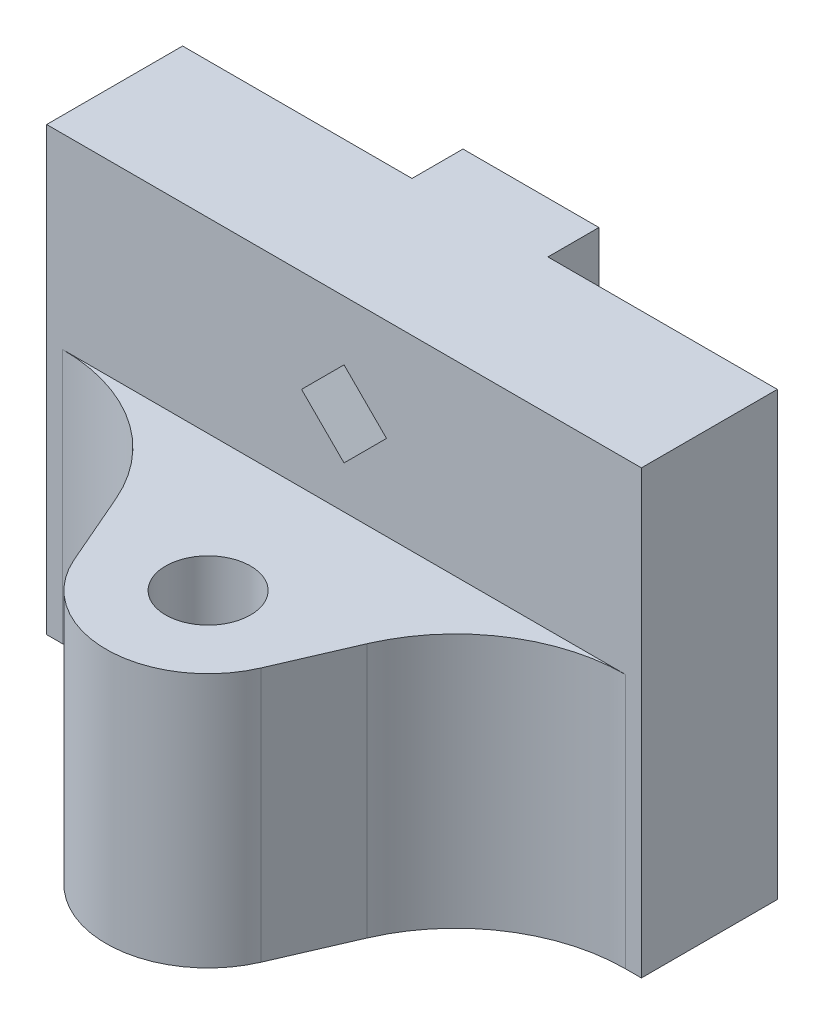
ISO-10303-21;
HEADER;
FILE_DESCRIPTION(('STEP AP214'),'2;1');
FILE_NAME('part.step','',(''),(''),'','','');
FILE_SCHEMA(('AUTOMOTIVE_DESIGN { 1 0 10303 214 1 1 1 1 }'));
ENDSEC;
DATA;
#1=APPLICATION_CONTEXT('core data for automotive mechanical design processes');
#2=APPLICATION_PROTOCOL_DEFINITION('international standard','automotive_design',2000,#1);
#3=PRODUCT_CONTEXT('',#1,'mechanical');
#4=PRODUCT('Part','Part','',(#3));
#5=PRODUCT_RELATED_PRODUCT_CATEGORY('part','',(#4));
#6=PRODUCT_DEFINITION_FORMATION('','',#4);
#7=PRODUCT_DEFINITION_CONTEXT('part definition',#1,'design');
#8=PRODUCT_DEFINITION('design','',#6,#7);
#9=PRODUCT_DEFINITION_SHAPE('','',#8);
#10=(LENGTH_UNIT() NAMED_UNIT(*) SI_UNIT(.MILLI.,.METRE.));
#11=(NAMED_UNIT(*) PLANE_ANGLE_UNIT() SI_UNIT($,.RADIAN.));
#12=(NAMED_UNIT(*) SI_UNIT($,.STERADIAN.) SOLID_ANGLE_UNIT());
#13=UNCERTAINTY_MEASURE_WITH_UNIT(LENGTH_MEASURE(1.E-05),#10,'distance_accuracy_value','');
#14=(GEOMETRIC_REPRESENTATION_CONTEXT(3) GLOBAL_UNCERTAINTY_ASSIGNED_CONTEXT((#13)) GLOBAL_UNIT_ASSIGNED_CONTEXT((#10,
#11,#12)) REPRESENTATION_CONTEXT('',''));
#15=CARTESIAN_POINT('',(0.,0.,0.));
#16=DIRECTION('',(0.,0.,1.));
#17=DIRECTION('',(1.,0.,0.));
#18=AXIS2_PLACEMENT_3D('',#15,#16,#17);
#19=CARTESIAN_POINT('',(0.,0.,0.));
#20=DIRECTION('',(0.,0.,1.));
#21=DIRECTION('',(1.,0.,0.));
#22=AXIS2_PLACEMENT_3D('',#19,#20,#21);
#23=PLANE('',#22);
#24=DIRECTION('',(0.,1.,0.));
#25=VECTOR('',#24,1.);
#26=CARTESIAN_POINT('',(-4.00000000000001,6.,0.));
#27=LINE('',#26,#25);
#28=CARTESIAN_POINT('',(-4.00000000000001,-20.,0.));
#29=VERTEX_POINT('',#28);
#30=CARTESIAN_POINT('',(-4.00000000000001,6.,0.));
#31=VERTEX_POINT('',#30);
#32=EDGE_CURVE('E205',#29,#31,#27,.T.);
#33=ORIENTED_EDGE('',*,*,#32,.F.);
#34=DIRECTION('',(1.,0.,0.));
#35=VECTOR('',#34,1.);
#36=CARTESIAN_POINT('',(-17.5,-20.,0.));
#37=LINE('',#36,#35);
#38=CARTESIAN_POINT('',(-17.5,-20.,0.));
#39=VERTEX_POINT('',#38);
#40=EDGE_CURVE('E371',#39,#29,#37,.T.);
#41=ORIENTED_EDGE('',*,*,#40,.F.);
#42=DIRECTION('',(0.,-1.,0.));
#43=VECTOR('',#42,1.);
#44=CARTESIAN_POINT('',(-17.5,5.99999999999999,0.));
#45=LINE('',#44,#43);
#46=CARTESIAN_POINT('',(-17.5,5.99999999999999,0.));
#47=VERTEX_POINT('',#46);
#48=EDGE_CURVE('E375',#47,#39,#45,.T.);
#49=ORIENTED_EDGE('',*,*,#48,.F.);
#50=DIRECTION('',(-1.,0.,0.));
#51=VECTOR('',#50,1.);
#52=CARTESIAN_POINT('',(17.5,6.,0.));
#53=LINE('',#52,#51);
#54=EDGE_CURVE('E354',#31,#47,#53,.T.);
#55=ORIENTED_EDGE('',*,*,#54,.F.);
#56=EDGE_LOOP('',(#33,#41,#49,#55));
#57=FACE_BOUND('',#56,.T.);
#58=ADVANCED_FACE('F34',(#57),#23,.F.);
#59=DIRECTION('',(0.,-1.,0.));
#60=VECTOR('',#59,1.);
#61=CARTESIAN_POINT('',(4.00000000000001,6.,0.));
#62=LINE('',#61,#60);
#63=CARTESIAN_POINT('',(4.,6.,0.));
#64=VERTEX_POINT('',#63);
#65=CARTESIAN_POINT('',(4.,-20.,0.));
#66=VERTEX_POINT('',#65);
#67=EDGE_CURVE('E201',#64,#66,#62,.T.);
#68=ORIENTED_EDGE('',*,*,#67,.F.);
#69=CARTESIAN_POINT('',(17.5,6.,0.));
#70=VERTEX_POINT('',#69);
#71=EDGE_CURVE('E347',#70,#64,#53,.T.);
#72=ORIENTED_EDGE('',*,*,#71,.F.);
#73=DIRECTION('',(0.,1.,0.));
#74=VECTOR('',#73,1.);
#75=CARTESIAN_POINT('',(17.5,6.,0.));
#76=LINE('',#75,#74);
#77=CARTESIAN_POINT('',(17.5,-20.,0.));
#78=VERTEX_POINT('',#77);
#79=EDGE_CURVE('E373',#78,#70,#76,.T.);
#80=ORIENTED_EDGE('',*,*,#79,.F.);
#81=EDGE_CURVE('E220',#66,#78,#37,.T.);
#82=ORIENTED_EDGE('',*,*,#81,.F.);
#83=EDGE_LOOP('',(#68,#72,#80,#82));
#84=FACE_BOUND('',#83,.T.);
#85=ADVANCED_FACE('F325',(#84),#23,.F.);
#86=CARTESIAN_POINT('',(0.,0.,8.));
#87=DIRECTION('',(0.,0.,1.));
#88=DIRECTION('',(1.,0.,0.));
#89=AXIS2_PLACEMENT_3D('',#86,#87,#88);
#90=PLANE('',#89);
#91=DIRECTION('',(1.,0.,0.));
#92=VECTOR('',#91,1.);
#93=CARTESIAN_POINT('',(0.,-5.,8.));
#94=LINE('',#93,#92);
#95=CARTESIAN_POINT('',(-16.5685424949238,-5.,8.));
#96=VERTEX_POINT('',#95);
#97=CARTESIAN_POINT('',(16.5685424949238,-5.,8.));
#98=VERTEX_POINT('',#97);
#99=EDGE_CURVE('E170',#96,#98,#94,.T.);
#100=ORIENTED_EDGE('',*,*,#99,.T.);
#101=DIRECTION('',(0.,-1.,0.));
#102=VECTOR('',#101,1.);
#103=CARTESIAN_POINT('',(16.5685424949238,-20.,8.));
#104=LINE('',#103,#102);
#105=CARTESIAN_POINT('',(16.5685424949238,-20.,8.));
#106=VERTEX_POINT('',#105);
#107=EDGE_CURVE('E267',#98,#106,#104,.T.);
#108=ORIENTED_EDGE('',*,*,#107,.T.);
#109=DIRECTION('',(1.,0.,0.));
#110=VECTOR('',#109,1.);
#111=CARTESIAN_POINT('',(-17.5,-20.,8.));
#112=LINE('',#111,#110);
#113=CARTESIAN_POINT('',(17.5,-20.,8.));
#114=VERTEX_POINT('',#113);
#115=EDGE_CURVE('E250',#106,#114,#112,.T.);
#116=ORIENTED_EDGE('',*,*,#115,.T.);
#117=DIRECTION('',(0.,1.,0.));
#118=VECTOR('',#117,1.);
#119=CARTESIAN_POINT('',(17.5,6.,8.));
#120=LINE('',#119,#118);
#121=CARTESIAN_POINT('',(17.5,6.,8.));
#122=VERTEX_POINT('',#121);
#123=EDGE_CURVE('E249',#114,#122,#120,.T.);
#124=ORIENTED_EDGE('',*,*,#123,.T.);
#125=DIRECTION('',(-1.,0.,0.));
#126=VECTOR('',#125,1.);
#127=CARTESIAN_POINT('',(17.5,6.,8.));
#128=LINE('',#127,#126);
#129=CARTESIAN_POINT('',(-17.5,5.99999999999999,8.));
#130=VERTEX_POINT('',#129);
#131=EDGE_CURVE('E390',#122,#130,#128,.T.);
#132=ORIENTED_EDGE('',*,*,#131,.T.);
#133=DIRECTION('',(0.,-1.,0.));
#134=VECTOR('',#133,1.);
#135=CARTESIAN_POINT('',(-17.5,5.99999999999999,8.));
#136=LINE('',#135,#134);
#137=CARTESIAN_POINT('',(-17.5,-20.,8.));
#138=VERTEX_POINT('',#137);
#139=EDGE_CURVE('E256',#130,#138,#136,.T.);
#140=ORIENTED_EDGE('',*,*,#139,.T.);
#141=CARTESIAN_POINT('',(-16.5685424949238,-20.,8.));
#142=VERTEX_POINT('',#141);
#143=EDGE_CURVE('E245',#138,#142,#112,.T.);
#144=ORIENTED_EDGE('',*,*,#143,.T.);
#145=DIRECTION('',(0.,-1.,0.));
#146=VECTOR('',#145,1.);
#147=CARTESIAN_POINT('',(-16.5685424949238,-5.,8.));
#148=LINE('',#147,#146);
#149=EDGE_CURVE('E264',#142,#96,#148,.F.);
#150=ORIENTED_EDGE('',*,*,#149,.T.);
#151=EDGE_LOOP('',(#100,#108,#116,#124,#132,#140,#144,#150));
#152=FACE_BOUND('',#151,.T.);
#153=DIRECTION('',(-0.707106781186548,-0.707106781186548,0.));
#154=VECTOR('',#153,1.);
#155=CARTESIAN_POINT('',(0.,2.5,8.));
#156=LINE('',#155,#154);
#157=CARTESIAN_POINT('',(0.,2.5,8.));
#158=VERTEX_POINT('',#157);
#159=CARTESIAN_POINT('',(-2.5,0.,8.));
#160=VERTEX_POINT('',#159);
#161=EDGE_CURVE('E407',#158,#160,#156,.T.);
#162=ORIENTED_EDGE('',*,*,#161,.F.);
#163=DIRECTION('',(-0.707106781186549,0.707106781186546,0.));
#164=VECTOR('',#163,1.);
#165=CARTESIAN_POINT('',(2.50000000000001,0.,8.));
#166=LINE('',#165,#164);
#167=CARTESIAN_POINT('',(2.50000000000001,0.,8.));
#168=VERTEX_POINT('',#167);
#169=EDGE_CURVE('E232',#168,#158,#166,.T.);
#170=ORIENTED_EDGE('',*,*,#169,.F.);
#171=DIRECTION('',(0.707106781186549,0.707106781186546,0.));
#172=VECTOR('',#171,1.);
#173=CARTESIAN_POINT('',(0.,-2.5,8.));
#174=LINE('',#173,#172);
#175=CARTESIAN_POINT('',(0.,-2.5,8.));
#176=VERTEX_POINT('',#175);
#177=EDGE_CURVE('E402',#176,#168,#174,.T.);
#178=ORIENTED_EDGE('',*,*,#177,.F.);
#179=DIRECTION('',(0.707106781186548,-0.707106781186548,0.));
#180=VECTOR('',#179,1.);
#181=CARTESIAN_POINT('',(-2.5,0.,8.));
#182=LINE('',#181,#180);
#183=EDGE_CURVE('E404',#160,#176,#182,.T.);
#184=ORIENTED_EDGE('',*,*,#183,.F.);
#185=EDGE_LOOP('',(#162,#170,#178,#184));
#186=FACE_BOUND('',#185,.T.);
#187=ADVANCED_FACE('F288',(#152,#186),#90,.T.);
#188=CARTESIAN_POINT('',(-17.5,5.99999999999999,8.));
#189=DIRECTION('',(1.,0.,0.));
#190=DIRECTION('',(0.,1.,0.));
#191=AXIS2_PLACEMENT_3D('',#188,#189,#190);
#192=PLANE('',#191);
#193=ORIENTED_EDGE('',*,*,#48,.T.);
#194=DIRECTION('',(0.,0.,-1.));
#195=VECTOR('',#194,1.);
#196=CARTESIAN_POINT('',(-17.5,-20.,8.));
#197=LINE('',#196,#195);
#198=EDGE_CURVE('E268',#138,#39,#197,.T.);
#199=ORIENTED_EDGE('',*,*,#198,.F.);
#200=ORIENTED_EDGE('',*,*,#139,.F.);
#201=DIRECTION('',(0.,0.,-1.));
#202=VECTOR('',#201,1.);
#203=CARTESIAN_POINT('',(-17.5,5.99999999999999,8.));
#204=LINE('',#203,#202);
#205=EDGE_CURVE('E383',#130,#47,#204,.T.);
#206=ORIENTED_EDGE('',*,*,#205,.T.);
#207=EDGE_LOOP('',(#193,#199,#200,#206));
#208=FACE_BOUND('',#207,.T.);
#209=ADVANCED_FACE('F313',(#208),#192,.F.);
#210=CARTESIAN_POINT('',(-17.5,-20.,8.));
#211=DIRECTION('',(0.,1.,0.));
#212=DIRECTION('',(-1.,0.,0.));
#213=AXIS2_PLACEMENT_3D('',#210,#211,#212);
#214=PLANE('',#213);
#215=ORIENTED_EDGE('',*,*,#40,.T.);
#216=DIRECTION('',(0.,0.,1.));
#217=VECTOR('',#216,1.);
#218=CARTESIAN_POINT('',(-4.00000000000001,-20.,-3.));
#219=LINE('',#218,#217);
#220=CARTESIAN_POINT('',(-4.00000000000001,-20.,-3.));
#221=VERTEX_POINT('',#220);
#222=EDGE_CURVE('E227',#221,#29,#219,.T.);
#223=ORIENTED_EDGE('',*,*,#222,.F.);
#224=DIRECTION('',(-1.,0.,0.));
#225=VECTOR('',#224,1.);
#226=CARTESIAN_POINT('',(4.,-20.,-3.));
#227=LINE('',#226,#225);
#228=CARTESIAN_POINT('',(4.,-20.,-3.));
#229=VERTEX_POINT('',#228);
#230=EDGE_CURVE('E207',#229,#221,#227,.T.);
#231=ORIENTED_EDGE('',*,*,#230,.F.);
#232=DIRECTION('',(0.,0.,1.));
#233=VECTOR('',#232,1.);
#234=CARTESIAN_POINT('',(4.,-20.,-3.));
#235=LINE('',#234,#233);
#236=EDGE_CURVE('E223',#229,#66,#235,.T.);
#237=ORIENTED_EDGE('',*,*,#236,.T.);
#238=ORIENTED_EDGE('',*,*,#81,.T.);
#239=DIRECTION('',(0.,0.,-1.));
#240=VECTOR('',#239,1.);
#241=CARTESIAN_POINT('',(17.5,-20.,8.));
#242=LINE('',#241,#240);
#243=EDGE_CURVE('E388',#114,#78,#242,.T.);
#244=ORIENTED_EDGE('',*,*,#243,.F.);
#245=ORIENTED_EDGE('',*,*,#115,.F.);
#246=CARTESIAN_POINT('',(16.5685424949238,-20.,18.));
#247=DIRECTION('',(0.,1.,0.));
#248=DIRECTION('',(-1.,0.,0.));
#249=AXIS2_PLACEMENT_3D('',#246,#247,#248);
#250=CIRCLE('',#249,10.);
#251=CARTESIAN_POINT('',(7.39112371493124,-20.,14.0282265250093));
#252=VERTEX_POINT('',#251);
#253=EDGE_CURVE('E276',#106,#252,#250,.T.);
#254=ORIENTED_EDGE('',*,*,#253,.T.);
#255=DIRECTION('',(-0.397177347499071,0.,0.917741877999256));
#256=VECTOR('',#255,1.);
#257=CARTESIAN_POINT('',(10.,-20.,8.));
#258=LINE('',#257,#256);
#259=CARTESIAN_POINT('',(5.50645126799554,-20.,18.3830640849944));
#260=VERTEX_POINT('',#259);
#261=EDGE_CURVE('E187',#252,#260,#258,.T.);
#262=ORIENTED_EDGE('',*,*,#261,.T.);
#263=CARTESIAN_POINT('',(0.,-20.,16.));
#264=DIRECTION('',(0.,-1.,0.));
#265=DIRECTION('',(-1.,0.,0.));
#266=AXIS2_PLACEMENT_3D('',#263,#264,#265);
#267=CIRCLE('',#266,5.99999999999999);
#268=CARTESIAN_POINT('',(-5.50645126799553,-20.,18.3830640849944));
#269=VERTEX_POINT('',#268);
#270=EDGE_CURVE('E176',#260,#269,#267,.T.);
#271=ORIENTED_EDGE('',*,*,#270,.T.);
#272=DIRECTION('',(-0.397177347499071,0.,-0.917741877999257));
#273=VECTOR('',#272,1.);
#274=CARTESIAN_POINT('',(-9.99999999999999,-20.,8.));
#275=LINE('',#274,#273);
#276=CARTESIAN_POINT('',(-7.39112371493123,-20.,14.0282265250093));
#277=VERTEX_POINT('',#276);
#278=EDGE_CURVE('E186',#269,#277,#275,.T.);
#279=ORIENTED_EDGE('',*,*,#278,.T.);
#280=CARTESIAN_POINT('',(-16.5685424949238,-20.,18.));
#281=DIRECTION('',(0.,1.,0.));
#282=DIRECTION('',(-1.,0.,0.));
#283=AXIS2_PLACEMENT_3D('',#280,#281,#282);
#284=CIRCLE('',#283,10.);
#285=EDGE_CURVE('E42',#277,#142,#284,.T.);
#286=ORIENTED_EDGE('',*,*,#285,.T.);
#287=ORIENTED_EDGE('',*,*,#143,.F.);
#288=ORIENTED_EDGE('',*,*,#198,.T.);
#289=EDGE_LOOP('',(#215,#223,#231,#237,#238,#244,#245,#254,#262,#271,#279,#286,#287,#288));
#290=FACE_BOUND('',#289,.T.);
#291=CARTESIAN_POINT('',(0.,-20.,16.));
#292=DIRECTION('',(0.,-1.,0.));
#293=DIRECTION('',(1.,0.,0.));
#294=AXIS2_PLACEMENT_3D('',#291,#292,#293);
#295=CIRCLE('',#294,2.5);
#296=CARTESIAN_POINT('',(2.5,-20.,16.));
#297=VERTEX_POINT('',#296);
#298=EDGE_CURVE('E299',#297,#297,#295,.T.);
#299=ORIENTED_EDGE('',*,*,#298,.F.);
#300=EDGE_LOOP('',(#299));
#301=FACE_BOUND('',#300,.T.);
#302=ADVANCED_FACE('F282',(#290,#301),#214,.F.);
#303=CARTESIAN_POINT('',(17.5,6.,8.));
#304=DIRECTION('',(-1.,0.,0.));
#305=DIRECTION('',(0.,-1.,0.));
#306=AXIS2_PLACEMENT_3D('',#303,#304,#305);
#307=PLANE('',#306);
#308=ORIENTED_EDGE('',*,*,#79,.T.);
#309=DIRECTION('',(0.,0.,-1.));
#310=VECTOR('',#309,1.);
#311=CARTESIAN_POINT('',(17.5,6.,8.));
#312=LINE('',#311,#310);
#313=EDGE_CURVE('E352',#122,#70,#312,.T.);
#314=ORIENTED_EDGE('',*,*,#313,.F.);
#315=ORIENTED_EDGE('',*,*,#123,.F.);
#316=ORIENTED_EDGE('',*,*,#243,.T.);
#317=EDGE_LOOP('',(#308,#314,#315,#316));
#318=FACE_BOUND('',#317,.T.);
#319=ADVANCED_FACE('F312',(#318),#307,.F.);
#320=CARTESIAN_POINT('',(17.5,6.,8.));
#321=DIRECTION('',(0.,-1.,0.));
#322=DIRECTION('',(1.,0.,0.));
#323=AXIS2_PLACEMENT_3D('',#320,#321,#322);
#324=PLANE('',#323);
#325=ORIENTED_EDGE('',*,*,#71,.T.);
#326=DIRECTION('',(0.,0.,1.));
#327=VECTOR('',#326,1.);
#328=CARTESIAN_POINT('',(4.00000000000001,6.,-3.));
#329=LINE('',#328,#327);
#330=CARTESIAN_POINT('',(4.00000000000001,6.,-3.));
#331=VERTEX_POINT('',#330);
#332=EDGE_CURVE('E226',#331,#64,#329,.T.);
#333=ORIENTED_EDGE('',*,*,#332,.F.);
#334=DIRECTION('',(1.,0.,0.));
#335=VECTOR('',#334,1.);
#336=CARTESIAN_POINT('',(0.,6.,-3.));
#337=LINE('',#336,#335);
#338=CARTESIAN_POINT('',(-4.00000000000001,6.,-3.));
#339=VERTEX_POINT('',#338);
#340=EDGE_CURVE('E202',#339,#331,#337,.T.);
#341=ORIENTED_EDGE('',*,*,#340,.F.);
#342=DIRECTION('',(0.,0.,1.));
#343=VECTOR('',#342,1.);
#344=CARTESIAN_POINT('',(-4.00000000000001,6.,-3.));
#345=LINE('',#344,#343);
#346=EDGE_CURVE('E211',#339,#31,#345,.T.);
#347=ORIENTED_EDGE('',*,*,#346,.T.);
#348=ORIENTED_EDGE('',*,*,#54,.T.);
#349=ORIENTED_EDGE('',*,*,#205,.F.);
#350=ORIENTED_EDGE('',*,*,#131,.F.);
#351=ORIENTED_EDGE('',*,*,#313,.T.);
#352=EDGE_LOOP('',(#325,#333,#341,#347,#348,#349,#350,#351));
#353=FACE_BOUND('',#352,.T.);
#354=ADVANCED_FACE('F319',(#353),#324,.F.);
#355=CARTESIAN_POINT('',(2.50000000000001,0.,8.));
#356=DIRECTION('',(-0.707106781186546,-0.707106781186549,0.));
#357=DIRECTION('',(0.707106781186549,-0.707106781186546,0.));
#358=AXIS2_PLACEMENT_3D('',#355,#356,#357);
#359=PLANE('',#358);
#360=DIRECTION('',(0.,0.,-1.));
#361=VECTOR('',#360,1.);
#362=CARTESIAN_POINT('',(0.,2.5,8.));
#363=LINE('',#362,#361);
#364=CARTESIAN_POINT('',(0.,2.5,-3.));
#365=VERTEX_POINT('',#364);
#366=EDGE_CURVE('E393',#158,#365,#363,.T.);
#367=ORIENTED_EDGE('',*,*,#366,.T.);
#368=DIRECTION('',(0.707106781186549,-0.707106781186546,0.));
#369=VECTOR('',#368,1.);
#370=CARTESIAN_POINT('',(0.,2.5,-3.));
#371=LINE('',#370,#369);
#372=CARTESIAN_POINT('',(2.50000000000001,0.,-3.));
#373=VERTEX_POINT('',#372);
#374=EDGE_CURVE('E195',#365,#373,#371,.T.);
#375=ORIENTED_EDGE('',*,*,#374,.T.);
#376=DIRECTION('',(0.,0.,-1.));
#377=VECTOR('',#376,1.);
#378=CARTESIAN_POINT('',(2.50000000000001,0.,8.));
#379=LINE('',#378,#377);
#380=EDGE_CURVE('E400',#168,#373,#379,.T.);
#381=ORIENTED_EDGE('',*,*,#380,.F.);
#382=ORIENTED_EDGE('',*,*,#169,.T.);
#383=EDGE_LOOP('',(#367,#375,#381,#382));
#384=FACE_BOUND('',#383,.T.);
#385=ADVANCED_FACE('F336',(#384),#359,.T.);
#386=CARTESIAN_POINT('',(0.,2.5,8.));
#387=DIRECTION('',(0.707106781186547,-0.707106781186547,0.));
#388=DIRECTION('',(0.707106781186548,0.707106781186548,0.));
#389=AXIS2_PLACEMENT_3D('',#386,#387,#388);
#390=PLANE('',#389);
#391=DIRECTION('',(0.,0.,-1.));
#392=VECTOR('',#391,1.);
#393=CARTESIAN_POINT('',(-2.5,0.,8.));
#394=LINE('',#393,#392);
#395=CARTESIAN_POINT('',(-2.5,0.,-3.));
#396=VERTEX_POINT('',#395);
#397=EDGE_CURVE('E394',#160,#396,#394,.T.);
#398=ORIENTED_EDGE('',*,*,#397,.T.);
#399=DIRECTION('',(0.707106781186548,0.707106781186548,0.));
#400=VECTOR('',#399,1.);
#401=CARTESIAN_POINT('',(-2.5,0.,-3.));
#402=LINE('',#401,#400);
#403=EDGE_CURVE('E192',#396,#365,#402,.T.);
#404=ORIENTED_EDGE('',*,*,#403,.T.);
#405=ORIENTED_EDGE('',*,*,#366,.F.);
#406=ORIENTED_EDGE('',*,*,#161,.T.);
#407=EDGE_LOOP('',(#398,#404,#405,#406));
#408=FACE_BOUND('',#407,.T.);
#409=ADVANCED_FACE('F341',(#408),#390,.T.);
#410=CARTESIAN_POINT('',(-2.5,0.,8.));
#411=DIRECTION('',(0.707106781186547,0.707106781186547,0.));
#412=DIRECTION('',(-0.707106781186548,0.707106781186548,0.));
#413=AXIS2_PLACEMENT_3D('',#410,#411,#412);
#414=PLANE('',#413);
#415=DIRECTION('',(0.,0.,-1.));
#416=VECTOR('',#415,1.);
#417=CARTESIAN_POINT('',(0.,-2.5,8.));
#418=LINE('',#417,#416);
#419=CARTESIAN_POINT('',(0.,-2.5,-3.));
#420=VERTEX_POINT('',#419);
#421=EDGE_CURVE('E396',#176,#420,#418,.T.);
#422=ORIENTED_EDGE('',*,*,#421,.T.);
#423=DIRECTION('',(-0.707106781186548,0.707106781186548,0.));
#424=VECTOR('',#423,1.);
#425=CARTESIAN_POINT('',(0.,-2.5,-3.));
#426=LINE('',#425,#424);
#427=EDGE_CURVE('E188',#420,#396,#426,.T.);
#428=ORIENTED_EDGE('',*,*,#427,.T.);
#429=ORIENTED_EDGE('',*,*,#397,.F.);
#430=ORIENTED_EDGE('',*,*,#183,.T.);
#431=EDGE_LOOP('',(#422,#428,#429,#430));
#432=FACE_BOUND('',#431,.T.);
#433=ADVANCED_FACE('F418',(#432),#414,.T.);
#434=CARTESIAN_POINT('',(0.,-2.5,8.));
#435=DIRECTION('',(-0.707106781186546,0.707106781186549,0.));
#436=DIRECTION('',(-0.707106781186549,-0.707106781186546,0.));
#437=AXIS2_PLACEMENT_3D('',#434,#435,#436);
#438=PLANE('',#437);
#439=ORIENTED_EDGE('',*,*,#380,.T.);
#440=DIRECTION('',(-0.707106781186549,-0.707106781186546,0.));
#441=VECTOR('',#440,1.);
#442=CARTESIAN_POINT('',(2.50000000000001,0.,-3.));
#443=LINE('',#442,#441);
#444=EDGE_CURVE('E198',#373,#420,#443,.T.);
#445=ORIENTED_EDGE('',*,*,#444,.T.);
#446=ORIENTED_EDGE('',*,*,#421,.F.);
#447=ORIENTED_EDGE('',*,*,#177,.T.);
#448=EDGE_LOOP('',(#439,#445,#446,#447));
#449=FACE_BOUND('',#448,.T.);
#450=ADVANCED_FACE('F422',(#449),#438,.T.);
#451=CARTESIAN_POINT('',(0.,0.,-3.));
#452=DIRECTION('',(0.,0.,1.));
#453=DIRECTION('',(1.,0.,0.));
#454=AXIS2_PLACEMENT_3D('',#451,#452,#453);
#455=PLANE('',#454);
#456=ORIENTED_EDGE('',*,*,#340,.T.);
#457=DIRECTION('',(0.,-1.,0.));
#458=VECTOR('',#457,1.);
#459=CARTESIAN_POINT('',(4.00000000000001,6.,-3.));
#460=LINE('',#459,#458);
#461=EDGE_CURVE('E204',#331,#229,#460,.T.);
#462=ORIENTED_EDGE('',*,*,#461,.T.);
#463=ORIENTED_EDGE('',*,*,#230,.T.);
#464=DIRECTION('',(0.,1.,0.));
#465=VECTOR('',#464,1.);
#466=CARTESIAN_POINT('',(-4.00000000000001,6.,-3.));
#467=LINE('',#466,#465);
#468=EDGE_CURVE('E209',#221,#339,#467,.T.);
#469=ORIENTED_EDGE('',*,*,#468,.T.);
#470=EDGE_LOOP('',(#456,#462,#463,#469));
#471=FACE_BOUND('',#470,.T.);
#472=ORIENTED_EDGE('',*,*,#427,.F.);
#473=ORIENTED_EDGE('',*,*,#444,.F.);
#474=ORIENTED_EDGE('',*,*,#374,.F.);
#475=ORIENTED_EDGE('',*,*,#403,.F.);
#476=EDGE_LOOP('',(#472,#473,#474,#475));
#477=FACE_BOUND('',#476,.T.);
#478=ADVANCED_FACE('F361',(#471,#477),#455,.F.);
#479=CARTESIAN_POINT('',(4.00000000000001,6.,-3.));
#480=DIRECTION('',(-1.,0.,0.));
#481=DIRECTION('',(0.,-1.,0.));
#482=AXIS2_PLACEMENT_3D('',#479,#480,#481);
#483=PLANE('',#482);
#484=ORIENTED_EDGE('',*,*,#67,.T.);
#485=ORIENTED_EDGE('',*,*,#236,.F.);
#486=ORIENTED_EDGE('',*,*,#461,.F.);
#487=ORIENTED_EDGE('',*,*,#332,.T.);
#488=EDGE_LOOP('',(#484,#485,#486,#487));
#489=FACE_BOUND('',#488,.T.);
#490=ADVANCED_FACE('F357',(#489),#483,.F.);
#491=CARTESIAN_POINT('',(-4.00000000000001,6.,-3.));
#492=DIRECTION('',(1.,0.,0.));
#493=DIRECTION('',(0.,1.,0.));
#494=AXIS2_PLACEMENT_3D('',#491,#492,#493);
#495=PLANE('',#494);
#496=ORIENTED_EDGE('',*,*,#32,.T.);
#497=ORIENTED_EDGE('',*,*,#346,.F.);
#498=ORIENTED_EDGE('',*,*,#468,.F.);
#499=ORIENTED_EDGE('',*,*,#222,.T.);
#500=EDGE_LOOP('',(#496,#497,#498,#499));
#501=FACE_BOUND('',#500,.T.);
#502=ADVANCED_FACE('F369',(#501),#495,.F.);
#503=CARTESIAN_POINT('',(-10.,-5.,8.));
#504=DIRECTION('',(-0.917741877999256,0.,0.397177347499071));
#505=DIRECTION('',(0.397177347499071,0.,0.917741877999257));
#506=AXIS2_PLACEMENT_3D('',#503,#504,#505);
#507=PLANE('',#506);
#508=DIRECTION('',(-0.397177347499071,0.,-0.917741877999257));
#509=VECTOR('',#508,1.);
#510=CARTESIAN_POINT('',(-10.,-5.,8.));
#511=LINE('',#510,#509);
#512=CARTESIAN_POINT('',(-5.50645126799553,-5.,18.3830640849944));
#513=VERTEX_POINT('',#512);
#514=CARTESIAN_POINT('',(-7.39112371493123,-5.,14.0282265250093));
#515=VERTEX_POINT('',#514);
#516=EDGE_CURVE('E178',#513,#515,#511,.T.);
#517=ORIENTED_EDGE('',*,*,#516,.T.);
#518=DIRECTION('',(0.,-1.,0.));
#519=VECTOR('',#518,1.);
#520=CARTESIAN_POINT('',(-7.39112371493123,-20.,14.0282265250093));
#521=LINE('',#520,#519);
#522=EDGE_CURVE('E274',#515,#277,#521,.T.);
#523=ORIENTED_EDGE('',*,*,#522,.T.);
#524=ORIENTED_EDGE('',*,*,#278,.F.);
#525=DIRECTION('',(0.,-1.,0.));
#526=VECTOR('',#525,1.);
#527=CARTESIAN_POINT('',(-5.50645126799553,-5.,18.3830640849944));
#528=LINE('',#527,#526);
#529=EDGE_CURVE('E177',#513,#269,#528,.T.);
#530=ORIENTED_EDGE('',*,*,#529,.F.);
#531=EDGE_LOOP('',(#517,#523,#524,#530));
#532=FACE_BOUND('',#531,.T.);
#533=ADVANCED_FACE('F293',(#532),#507,.T.);
#534=CARTESIAN_POINT('',(0.,-5.,16.));
#535=DIRECTION('',(0.,-1.,0.));
#536=DIRECTION('',(1.,0.,0.));
#537=AXIS2_PLACEMENT_3D('',#534,#535,#536);
#538=CYLINDRICAL_SURFACE('',#537,5.99999999999999);
#539=ORIENTED_EDGE('',*,*,#270,.F.);
#540=DIRECTION('',(0.,-1.,0.));
#541=VECTOR('',#540,1.);
#542=CARTESIAN_POINT('',(5.50645126799554,-5.,18.3830640849944));
#543=LINE('',#542,#541);
#544=CARTESIAN_POINT('',(5.50645126799554,-5.,18.3830640849944));
#545=VERTEX_POINT('',#544);
#546=EDGE_CURVE('E162',#545,#260,#543,.T.);
#547=ORIENTED_EDGE('',*,*,#546,.F.);
#548=CARTESIAN_POINT('',(0.,-5.,16.));
#549=DIRECTION('',(0.,-1.,0.));
#550=DIRECTION('',(-1.,0.,0.));
#551=AXIS2_PLACEMENT_3D('',#548,#549,#550);
#552=CIRCLE('',#551,5.99999999999999);
#553=EDGE_CURVE('E169',#545,#513,#552,.T.);
#554=ORIENTED_EDGE('',*,*,#553,.T.);
#555=ORIENTED_EDGE('',*,*,#529,.T.);
#556=EDGE_LOOP('',(#539,#547,#554,#555));
#557=FACE_BOUND('',#556,.T.);
#558=ADVANCED_FACE('F174',(#557),#538,.T.);
#559=CARTESIAN_POINT('',(10.,-5.,8.));
#560=DIRECTION('',(0.917741877999256,0.,0.397177347499071));
#561=DIRECTION('',(0.397177347499071,0.,-0.917741877999256));
#562=AXIS2_PLACEMENT_3D('',#559,#560,#561);
#563=PLANE('',#562);
#564=ORIENTED_EDGE('',*,*,#261,.F.);
#565=DIRECTION('',(0.,-1.,0.));
#566=VECTOR('',#565,1.);
#567=CARTESIAN_POINT('',(7.39112371493124,-5.,14.0282265250093));
#568=LINE('',#567,#566);
#569=CARTESIAN_POINT('',(7.39112371493124,-5.,14.0282265250093));
#570=VERTEX_POINT('',#569);
#571=EDGE_CURVE('E165',#252,#570,#568,.F.);
#572=ORIENTED_EDGE('',*,*,#571,.T.);
#573=DIRECTION('',(-0.397177347499071,0.,0.917741877999256));
#574=VECTOR('',#573,1.);
#575=CARTESIAN_POINT('',(10.,-5.,8.));
#576=LINE('',#575,#574);
#577=EDGE_CURVE('E158',#570,#545,#576,.T.);
#578=ORIENTED_EDGE('',*,*,#577,.T.);
#579=ORIENTED_EDGE('',*,*,#546,.T.);
#580=EDGE_LOOP('',(#564,#572,#578,#579));
#581=FACE_BOUND('',#580,.T.);
#582=ADVANCED_FACE('F161',(#581),#563,.T.);
#583=CARTESIAN_POINT('',(0.,-5.,16.));
#584=DIRECTION('',(0.,1.,0.));
#585=DIRECTION('',(-1.,0.,0.));
#586=AXIS2_PLACEMENT_3D('',#583,#584,#585);
#587=PLANE('',#586);
#588=CARTESIAN_POINT('',(0.,-5.,16.));
#589=DIRECTION('',(0.,-1.,0.));
#590=DIRECTION('',(1.,0.,0.));
#591=AXIS2_PLACEMENT_3D('',#588,#589,#590);
#592=CIRCLE('',#591,2.5);
#593=CARTESIAN_POINT('',(2.5,-5.,16.));
#594=VERTEX_POINT('',#593);
#595=EDGE_CURVE('E272',#594,#594,#592,.T.);
#596=ORIENTED_EDGE('',*,*,#595,.T.);
#597=EDGE_LOOP('',(#596));
#598=FACE_BOUND('',#597,.T.);
#599=ORIENTED_EDGE('',*,*,#99,.F.);
#600=CARTESIAN_POINT('',(-16.5685424949238,-5.,18.));
#601=DIRECTION('',(0.,1.,0.));
#602=DIRECTION('',(-1.,0.,0.));
#603=AXIS2_PLACEMENT_3D('',#600,#601,#602);
#604=CIRCLE('',#603,10.);
#605=EDGE_CURVE('E11',#96,#515,#604,.F.);
#606=ORIENTED_EDGE('',*,*,#605,.T.);
#607=ORIENTED_EDGE('',*,*,#516,.F.);
#608=ORIENTED_EDGE('',*,*,#553,.F.);
#609=ORIENTED_EDGE('',*,*,#577,.F.);
#610=CARTESIAN_POINT('',(16.5685424949238,-5.,18.));
#611=DIRECTION('',(0.,1.,0.));
#612=DIRECTION('',(-1.,0.,0.));
#613=AXIS2_PLACEMENT_3D('',#610,#611,#612);
#614=CIRCLE('',#613,10.);
#615=EDGE_CURVE('E278',#570,#98,#614,.F.);
#616=ORIENTED_EDGE('',*,*,#615,.T.);
#617=EDGE_LOOP('',(#599,#606,#607,#608,#609,#616));
#618=FACE_BOUND('',#617,.T.);
#619=ADVANCED_FACE('F180',(#598,#618),#587,.T.);
#620=CARTESIAN_POINT('',(0.,-5.,16.));
#621=DIRECTION('',(0.,-1.,0.));
#622=DIRECTION('',(1.,0.,0.));
#623=AXIS2_PLACEMENT_3D('',#620,#621,#622);
#624=CYLINDRICAL_SURFACE('',#623,2.5);
#625=ORIENTED_EDGE('',*,*,#595,.F.);
#626=EDGE_LOOP('',(#625));
#627=FACE_BOUND('',#626,.T.);
#628=ORIENTED_EDGE('',*,*,#298,.T.);
#629=EDGE_LOOP('',(#628));
#630=FACE_BOUND('',#629,.T.);
#631=ADVANCED_FACE('F306',(#627,#630),#624,.F.);
#632=CARTESIAN_POINT('',(16.5685424949238,0.,18.));
#633=DIRECTION('',(0.,1.,0.));
#634=DIRECTION('',(-1.,0.,0.));
#635=AXIS2_PLACEMENT_3D('',#632,#633,#634);
#636=CYLINDRICAL_SURFACE('',#635,10.);
#637=ORIENTED_EDGE('',*,*,#615,.F.);
#638=ORIENTED_EDGE('',*,*,#571,.F.);
#639=ORIENTED_EDGE('',*,*,#253,.F.);
#640=ORIENTED_EDGE('',*,*,#107,.F.);
#641=EDGE_LOOP('',(#637,#638,#639,#640));
#642=FACE_BOUND('',#641,.T.);
#643=ADVANCED_FACE('F296',(#642),#636,.F.);
#644=CARTESIAN_POINT('',(-16.5685424949238,-5.,18.));
#645=DIRECTION('',(0.,1.,0.));
#646=DIRECTION('',(-1.,0.,0.));
#647=AXIS2_PLACEMENT_3D('',#644,#645,#646);
#648=CYLINDRICAL_SURFACE('',#647,10.);
#649=ORIENTED_EDGE('',*,*,#605,.F.);
#650=ORIENTED_EDGE('',*,*,#149,.F.);
#651=ORIENTED_EDGE('',*,*,#285,.F.);
#652=ORIENTED_EDGE('',*,*,#522,.F.);
#653=EDGE_LOOP('',(#649,#650,#651,#652));
#654=FACE_BOUND('',#653,.T.);
#655=ADVANCED_FACE('F36',(#654),#648,.F.);
#656=CLOSED_SHELL('',(#58,#85,#187,#209,#302,#319,#354,#385,#409,#433,#450,#478,#490,#502,#533,
#558,#582,#619,#631,#643,#655));
#657=MANIFOLD_SOLID_BREP('B2',#656);
#658=ADVANCED_BREP_SHAPE_REPRESENTATION('',(#18,#657),#14);
#659=SHAPE_DEFINITION_REPRESENTATION(#9,#658);
ENDSEC;
END-ISO-10303-21;
